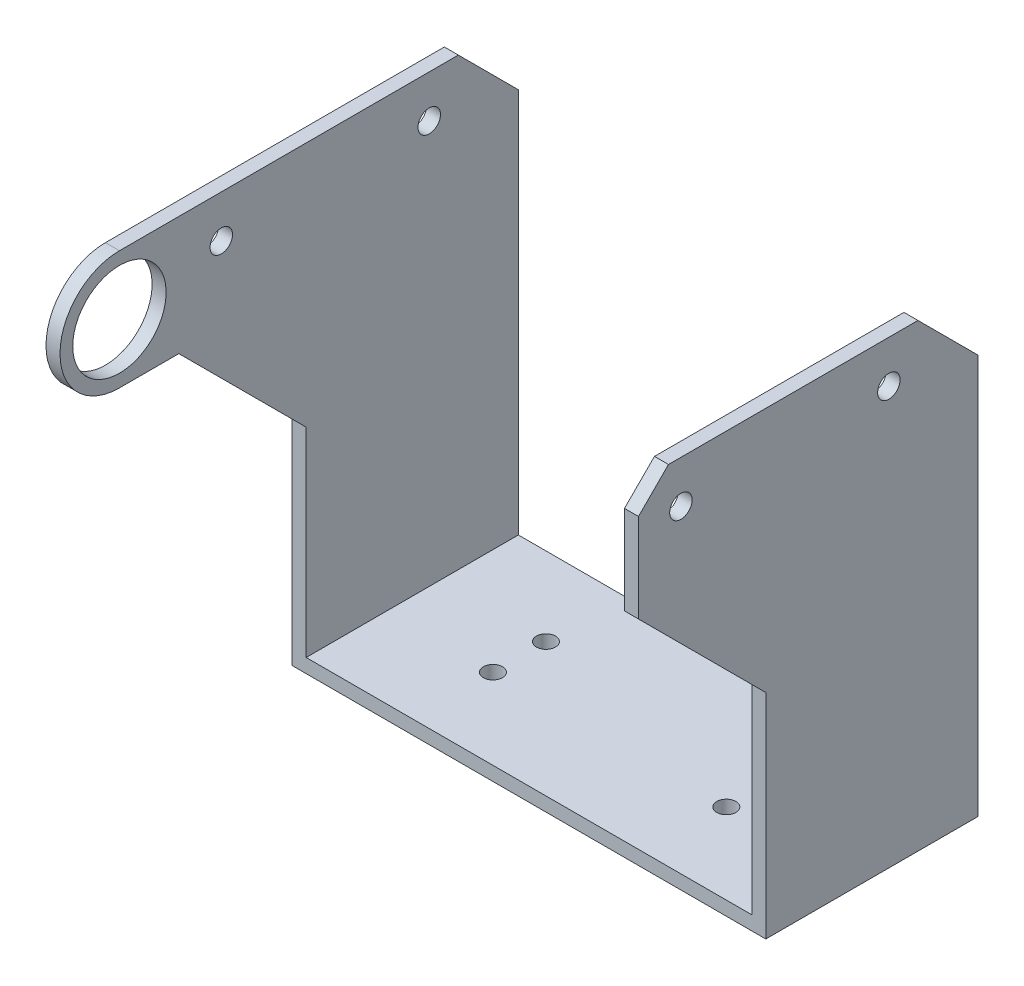
ISO-10303-21;
HEADER;
FILE_DESCRIPTION(('STEP AP214'),'2;1');
FILE_NAME('part.step','',(''),(''),'','','');
FILE_SCHEMA(('AUTOMOTIVE_DESIGN { 1 0 10303 214 1 1 1 1 }'));
ENDSEC;
DATA;
#1=APPLICATION_CONTEXT('core data for automotive mechanical design processes');
#2=APPLICATION_PROTOCOL_DEFINITION('international standard','automotive_design',2000,#1);
#3=PRODUCT_CONTEXT('',#1,'mechanical');
#4=PRODUCT('Part','Part','',(#3));
#5=PRODUCT_RELATED_PRODUCT_CATEGORY('part','',(#4));
#6=PRODUCT_DEFINITION_FORMATION('','',#4);
#7=PRODUCT_DEFINITION_CONTEXT('part definition',#1,'design');
#8=PRODUCT_DEFINITION('design','',#6,#7);
#9=PRODUCT_DEFINITION_SHAPE('','',#8);
#10=(LENGTH_UNIT() NAMED_UNIT(*) SI_UNIT(.MILLI.,.METRE.));
#11=(NAMED_UNIT(*) PLANE_ANGLE_UNIT() SI_UNIT($,.RADIAN.));
#12=(NAMED_UNIT(*) SI_UNIT($,.STERADIAN.) SOLID_ANGLE_UNIT());
#13=UNCERTAINTY_MEASURE_WITH_UNIT(LENGTH_MEASURE(1.E-05),#10,'distance_accuracy_value','');
#14=(GEOMETRIC_REPRESENTATION_CONTEXT(3) GLOBAL_UNCERTAINTY_ASSIGNED_CONTEXT((#13)) GLOBAL_UNIT_ASSIGNED_CONTEXT((#10,
#11,#12)) REPRESENTATION_CONTEXT('',''));
#15=CARTESIAN_POINT('',(0.,0.,0.));
#16=DIRECTION('',(0.,0.,1.));
#17=DIRECTION('',(1.,0.,0.));
#18=AXIS2_PLACEMENT_3D('',#15,#16,#17);
#19=CARTESIAN_POINT('',(0.,3.3,0.));
#20=DIRECTION('',(0.,-1.,0.));
#21=DIRECTION('',(0.,0.,-1.));
#22=AXIS2_PLACEMENT_3D('',#19,#20,#21);
#23=PLANE('',#22);
#24=DIRECTION('',(0.,0.,-1.));
#25=VECTOR('',#24,1.);
#26=CARTESIAN_POINT('',(52.5,3.3,25.));
#27=LINE('',#26,#25);
#28=CARTESIAN_POINT('',(52.5,3.3,25.));
#29=VERTEX_POINT('',#28);
#30=CARTESIAN_POINT('',(52.5,3.3,-25.));
#31=VERTEX_POINT('',#30);
#32=EDGE_CURVE('E266',#29,#31,#27,.T.);
#33=ORIENTED_EDGE('',*,*,#32,.T.);
#34=DIRECTION('',(-1.,0.,0.));
#35=VECTOR('',#34,1.);
#36=CARTESIAN_POINT('',(-52.5,3.3,-25.));
#37=LINE('',#36,#35);
#38=CARTESIAN_POINT('',(-52.5,3.3,-25.));
#39=VERTEX_POINT('',#38);
#40=EDGE_CURVE('E269',#31,#39,#37,.T.);
#41=ORIENTED_EDGE('',*,*,#40,.T.);
#42=DIRECTION('',(0.,0.,1.));
#43=VECTOR('',#42,1.);
#44=CARTESIAN_POINT('',(-52.5,3.3,25.));
#45=LINE('',#44,#43);
#46=CARTESIAN_POINT('',(-52.5,3.3,25.));
#47=VERTEX_POINT('',#46);
#48=EDGE_CURVE('E44',#39,#47,#45,.T.);
#49=ORIENTED_EDGE('',*,*,#48,.T.);
#50=DIRECTION('',(1.,0.,0.));
#51=VECTOR('',#50,1.);
#52=CARTESIAN_POINT('',(-52.5,3.3,25.));
#53=LINE('',#52,#51);
#54=EDGE_CURVE('E11',#47,#29,#53,.T.);
#55=ORIENTED_EDGE('',*,*,#54,.T.);
#56=EDGE_LOOP('',(#33,#41,#49,#55));
#57=FACE_BOUND('',#56,.T.);
#58=CARTESIAN_POINT('',(-27.5,3.3,-6.49999999999999));
#59=DIRECTION('',(0.,1.,0.));
#60=DIRECTION('',(0.,0.,1.));
#61=AXIS2_PLACEMENT_3D('',#58,#59,#60);
#62=CIRCLE('',#61,2.25);
#63=CARTESIAN_POINT('',(-27.5,3.3,-4.24999999999999));
#64=VERTEX_POINT('',#63);
#65=EDGE_CURVE('E260',#64,#64,#62,.T.);
#66=ORIENTED_EDGE('',*,*,#65,.F.);
#67=EDGE_LOOP('',(#66));
#68=FACE_BOUND('',#67,.T.);
#69=CARTESIAN_POINT('',(-27.5,3.3,6.00000000000001));
#70=DIRECTION('',(0.,1.,0.));
#71=DIRECTION('',(0.,0.,1.));
#72=AXIS2_PLACEMENT_3D('',#69,#70,#71);
#73=CIRCLE('',#72,2.25);
#74=CARTESIAN_POINT('',(-27.5,3.3,8.25000000000001));
#75=VERTEX_POINT('',#74);
#76=EDGE_CURVE('E254',#75,#75,#73,.T.);
#77=ORIENTED_EDGE('',*,*,#76,.F.);
#78=EDGE_LOOP('',(#77));
#79=FACE_BOUND('',#78,.T.);
#80=CARTESIAN_POINT('',(27.5,3.3,6.00000000000001));
#81=DIRECTION('',(0.,1.,0.));
#82=DIRECTION('',(0.,0.,-1.));
#83=AXIS2_PLACEMENT_3D('',#80,#81,#82);
#84=CIRCLE('',#83,2.25);
#85=CARTESIAN_POINT('',(27.5,3.3,3.75000000000001));
#86=VERTEX_POINT('',#85);
#87=EDGE_CURVE('E248',#86,#86,#84,.T.);
#88=ORIENTED_EDGE('',*,*,#87,.F.);
#89=EDGE_LOOP('',(#88));
#90=FACE_BOUND('',#89,.T.);
#91=CARTESIAN_POINT('',(27.5,3.3,-6.49999999999999));
#92=DIRECTION('',(0.,1.,0.));
#93=DIRECTION('',(0.,0.,-1.));
#94=AXIS2_PLACEMENT_3D('',#91,#92,#93);
#95=CIRCLE('',#94,2.25);
#96=CARTESIAN_POINT('',(27.5,3.3,-8.74999999999999));
#97=VERTEX_POINT('',#96);
#98=EDGE_CURVE('E242',#97,#97,#95,.T.);
#99=ORIENTED_EDGE('',*,*,#98,.F.);
#100=EDGE_LOOP('',(#99));
#101=FACE_BOUND('',#100,.T.);
#102=ADVANCED_FACE('F35',(#57,#68,#79,#90,#101),#23,.F.);
#103=CARTESIAN_POINT('',(0.,0.,0.));
#104=DIRECTION('',(0.,-1.,0.));
#105=DIRECTION('',(0.,0.,-1.));
#106=AXIS2_PLACEMENT_3D('',#103,#104,#105);
#107=PLANE('',#106);
#108=CARTESIAN_POINT('',(27.5,0.,6.00000000000001));
#109=DIRECTION('',(0.,1.,0.));
#110=DIRECTION('',(0.,0.,-1.));
#111=AXIS2_PLACEMENT_3D('',#108,#109,#110);
#112=CIRCLE('',#111,2.25);
#113=CARTESIAN_POINT('',(27.5,0.,3.75000000000001));
#114=VERTEX_POINT('',#113);
#115=EDGE_CURVE('E245',#114,#114,#112,.T.);
#116=ORIENTED_EDGE('',*,*,#115,.T.);
#117=EDGE_LOOP('',(#116));
#118=FACE_BOUND('',#117,.T.);
#119=CARTESIAN_POINT('',(-27.5,0.,-6.49999999999999));
#120=DIRECTION('',(0.,1.,0.));
#121=DIRECTION('',(0.,0.,1.));
#122=AXIS2_PLACEMENT_3D('',#119,#120,#121);
#123=CIRCLE('',#122,2.25);
#124=CARTESIAN_POINT('',(-27.5,0.,-4.24999999999999));
#125=VERTEX_POINT('',#124);
#126=EDGE_CURVE('E257',#125,#125,#123,.T.);
#127=ORIENTED_EDGE('',*,*,#126,.T.);
#128=EDGE_LOOP('',(#127));
#129=FACE_BOUND('',#128,.T.);
#130=DIRECTION('',(-1.,0.,0.));
#131=VECTOR('',#130,1.);
#132=CARTESIAN_POINT('',(-52.5,0.,-25.));
#133=LINE('',#132,#131);
#134=CARTESIAN_POINT('',(55.8,0.,-25.));
#135=VERTEX_POINT('',#134);
#136=CARTESIAN_POINT('',(-55.8,0.,-25.));
#137=VERTEX_POINT('',#136);
#138=EDGE_CURVE('E263',#135,#137,#133,.T.);
#139=ORIENTED_EDGE('',*,*,#138,.F.);
#140=DIRECTION('',(0.,0.,-1.));
#141=VECTOR('',#140,1.);
#142=CARTESIAN_POINT('',(55.8,0.,25.));
#143=LINE('',#142,#141);
#144=CARTESIAN_POINT('',(55.8,0.,25.));
#145=VERTEX_POINT('',#144);
#146=EDGE_CURVE('E191',#145,#135,#143,.T.);
#147=ORIENTED_EDGE('',*,*,#146,.F.);
#148=DIRECTION('',(1.,0.,0.));
#149=VECTOR('',#148,1.);
#150=CARTESIAN_POINT('',(-52.5,0.,25.));
#151=LINE('',#150,#149);
#152=CARTESIAN_POINT('',(-55.8,0.,25.));
#153=VERTEX_POINT('',#152);
#154=EDGE_CURVE('E39',#153,#145,#151,.T.);
#155=ORIENTED_EDGE('',*,*,#154,.F.);
#156=DIRECTION('',(0.,0.,1.));
#157=VECTOR('',#156,1.);
#158=CARTESIAN_POINT('',(-55.8,0.,-25.));
#159=LINE('',#158,#157);
#160=EDGE_CURVE('E168',#137,#153,#159,.T.);
#161=ORIENTED_EDGE('',*,*,#160,.F.);
#162=EDGE_LOOP('',(#139,#147,#155,#161));
#163=FACE_BOUND('',#162,.T.);
#164=CARTESIAN_POINT('',(-27.5,0.,6.00000000000001));
#165=DIRECTION('',(0.,1.,0.));
#166=DIRECTION('',(0.,0.,1.));
#167=AXIS2_PLACEMENT_3D('',#164,#165,#166);
#168=CIRCLE('',#167,2.25);
#169=CARTESIAN_POINT('',(-27.5,0.,8.25000000000001));
#170=VERTEX_POINT('',#169);
#171=EDGE_CURVE('E251',#170,#170,#168,.T.);
#172=ORIENTED_EDGE('',*,*,#171,.T.);
#173=EDGE_LOOP('',(#172));
#174=FACE_BOUND('',#173,.T.);
#175=CARTESIAN_POINT('',(27.5,0.,-6.49999999999999));
#176=DIRECTION('',(0.,1.,0.));
#177=DIRECTION('',(0.,0.,-1.));
#178=AXIS2_PLACEMENT_3D('',#175,#176,#177);
#179=CIRCLE('',#178,2.25);
#180=CARTESIAN_POINT('',(27.5,0.,-8.74999999999999));
#181=VERTEX_POINT('',#180);
#182=EDGE_CURVE('E241',#181,#181,#179,.T.);
#183=ORIENTED_EDGE('',*,*,#182,.T.);
#184=EDGE_LOOP('',(#183));
#185=FACE_BOUND('',#184,.T.);
#186=ADVANCED_FACE('F283',(#118,#129,#163,#174,#185),#107,.T.);
#187=CARTESIAN_POINT('',(-52.5,3.3,-25.));
#188=DIRECTION('',(0.,0.,1.));
#189=DIRECTION('',(1.,0.,0.));
#190=AXIS2_PLACEMENT_3D('',#187,#188,#189);
#191=PLANE('',#190);
#192=ORIENTED_EDGE('',*,*,#138,.T.);
#193=DIRECTION('',(0.,-1.,0.));
#194=VECTOR('',#193,1.);
#195=CARTESIAN_POINT('',(-55.8,94.1578643762691,-25.0000000000001));
#196=LINE('',#195,#194);
#197=CARTESIAN_POINT('',(-55.8,94.1578643762691,-25.0000000000001));
#198=VERTEX_POINT('',#197);
#199=EDGE_CURVE('E354',#198,#137,#196,.T.);
#200=ORIENTED_EDGE('',*,*,#199,.F.);
#201=DIRECTION('',(1.,0.,0.));
#202=VECTOR('',#201,1.);
#203=CARTESIAN_POINT('',(-55.8,94.1578643762691,-25.0000000000001));
#204=LINE('',#203,#202);
#205=CARTESIAN_POINT('',(-52.5,94.1578643762691,-25.0000000000001));
#206=VERTEX_POINT('',#205);
#207=EDGE_CURVE('E320',#198,#206,#204,.T.);
#208=ORIENTED_EDGE('',*,*,#207,.T.);
#209=DIRECTION('',(0.,-1.,0.));
#210=VECTOR('',#209,1.);
#211=CARTESIAN_POINT('',(-52.5,94.1578643762691,-25.0000000000001));
#212=LINE('',#211,#210);
#213=EDGE_CURVE('E170',#206,#39,#212,.T.);
#214=ORIENTED_EDGE('',*,*,#213,.T.);
#215=ORIENTED_EDGE('',*,*,#40,.F.);
#216=DIRECTION('',(0.,1.,0.));
#217=VECTOR('',#216,1.);
#218=CARTESIAN_POINT('',(52.5,0.,-25.));
#219=LINE('',#218,#217);
#220=CARTESIAN_POINT('',(52.5,94.1578643762691,-25.0000000000001));
#221=VERTEX_POINT('',#220);
#222=EDGE_CURVE('E60',#31,#221,#219,.T.);
#223=ORIENTED_EDGE('',*,*,#222,.T.);
#224=DIRECTION('',(-1.,0.,0.));
#225=VECTOR('',#224,1.);
#226=CARTESIAN_POINT('',(55.8,94.1578643762691,-25.0000000000001));
#227=LINE('',#226,#225);
#228=CARTESIAN_POINT('',(55.8,94.1578643762691,-25.0000000000001));
#229=VERTEX_POINT('',#228);
#230=EDGE_CURVE('E238',#229,#221,#227,.T.);
#231=ORIENTED_EDGE('',*,*,#230,.F.);
#232=DIRECTION('',(0.,1.,0.));
#233=VECTOR('',#232,1.);
#234=CARTESIAN_POINT('',(55.8,0.,-25.));
#235=LINE('',#234,#233);
#236=EDGE_CURVE('E194',#135,#229,#235,.T.);
#237=ORIENTED_EDGE('',*,*,#236,.F.);
#238=EDGE_LOOP('',(#192,#200,#208,#214,#215,#223,#231,#237));
#239=FACE_BOUND('',#238,.T.);
#240=ADVANCED_FACE('F37',(#239),#191,.F.);
#241=CARTESIAN_POINT('',(-52.5,3.3,25.));
#242=DIRECTION('',(0.,0.,-1.));
#243=DIRECTION('',(-1.,0.,0.));
#244=AXIS2_PLACEMENT_3D('',#241,#242,#243);
#245=PLANE('',#244);
#246=ORIENTED_EDGE('',*,*,#154,.T.);
#247=DIRECTION('',(0.,-1.,0.));
#248=VECTOR('',#247,1.);
#249=CARTESIAN_POINT('',(55.8,50.3,25.));
#250=LINE('',#249,#248);
#251=CARTESIAN_POINT('',(55.8,50.3,25.));
#252=VERTEX_POINT('',#251);
#253=EDGE_CURVE('E207',#252,#145,#250,.T.);
#254=ORIENTED_EDGE('',*,*,#253,.F.);
#255=DIRECTION('',(-1.,0.,0.));
#256=VECTOR('',#255,1.);
#257=CARTESIAN_POINT('',(55.8,50.3,25.));
#258=LINE('',#257,#256);
#259=CARTESIAN_POINT('',(52.5,50.3,25.));
#260=VERTEX_POINT('',#259);
#261=EDGE_CURVE('E210',#252,#260,#258,.T.);
#262=ORIENTED_EDGE('',*,*,#261,.T.);
#263=DIRECTION('',(0.,-1.,0.));
#264=VECTOR('',#263,1.);
#265=CARTESIAN_POINT('',(52.5,50.3,25.));
#266=LINE('',#265,#264);
#267=EDGE_CURVE('E195',#260,#29,#266,.T.);
#268=ORIENTED_EDGE('',*,*,#267,.T.);
#269=ORIENTED_EDGE('',*,*,#54,.F.);
#270=DIRECTION('',(0.,1.,0.));
#271=VECTOR('',#270,1.);
#272=CARTESIAN_POINT('',(-52.5,0.,25.));
#273=LINE('',#272,#271);
#274=CARTESIAN_POINT('',(-52.5,50.3,25.));
#275=VERTEX_POINT('',#274);
#276=EDGE_CURVE('E52',#47,#275,#273,.T.);
#277=ORIENTED_EDGE('',*,*,#276,.T.);
#278=DIRECTION('',(1.,0.,0.));
#279=VECTOR('',#278,1.);
#280=CARTESIAN_POINT('',(-55.8,50.3,25.));
#281=LINE('',#280,#279);
#282=CARTESIAN_POINT('',(-55.8,50.3,25.));
#283=VERTEX_POINT('',#282);
#284=EDGE_CURVE('E154',#283,#275,#281,.T.);
#285=ORIENTED_EDGE('',*,*,#284,.F.);
#286=DIRECTION('',(0.,1.,0.));
#287=VECTOR('',#286,1.);
#288=CARTESIAN_POINT('',(-55.8,0.,25.));
#289=LINE('',#288,#287);
#290=EDGE_CURVE('E160',#153,#283,#289,.T.);
#291=ORIENTED_EDGE('',*,*,#290,.F.);
#292=EDGE_LOOP('',(#246,#254,#262,#268,#269,#277,#285,#291));
#293=FACE_BOUND('',#292,.T.);
#294=ADVANCED_FACE('F172',(#293),#245,.F.);
#295=CARTESIAN_POINT('',(-27.5,3.3,-6.49999999999999));
#296=DIRECTION('',(0.,-1.,0.));
#297=DIRECTION('',(0.,0.,-1.));
#298=AXIS2_PLACEMENT_3D('',#295,#296,#297);
#299=CYLINDRICAL_SURFACE('',#298,2.25);
#300=ORIENTED_EDGE('',*,*,#65,.T.);
#301=EDGE_LOOP('',(#300));
#302=FACE_BOUND('',#301,.T.);
#303=ORIENTED_EDGE('',*,*,#126,.F.);
#304=EDGE_LOOP('',(#303));
#305=FACE_BOUND('',#304,.T.);
#306=ADVANCED_FACE('F405',(#302,#305),#299,.F.);
#307=CARTESIAN_POINT('',(-27.5,3.3,6.00000000000001));
#308=DIRECTION('',(0.,-1.,0.));
#309=DIRECTION('',(0.,0.,-1.));
#310=AXIS2_PLACEMENT_3D('',#307,#308,#309);
#311=CYLINDRICAL_SURFACE('',#310,2.25);
#312=ORIENTED_EDGE('',*,*,#76,.T.);
#313=EDGE_LOOP('',(#312));
#314=FACE_BOUND('',#313,.T.);
#315=ORIENTED_EDGE('',*,*,#171,.F.);
#316=EDGE_LOOP('',(#315));
#317=FACE_BOUND('',#316,.T.);
#318=ADVANCED_FACE('F412',(#314,#317),#311,.F.);
#319=CARTESIAN_POINT('',(27.5,3.3,6.00000000000001));
#320=DIRECTION('',(0.,-1.,0.));
#321=DIRECTION('',(0.,0.,-1.));
#322=AXIS2_PLACEMENT_3D('',#319,#320,#321);
#323=CYLINDRICAL_SURFACE('',#322,2.25);
#324=ORIENTED_EDGE('',*,*,#87,.T.);
#325=EDGE_LOOP('',(#324));
#326=FACE_BOUND('',#325,.T.);
#327=ORIENTED_EDGE('',*,*,#115,.F.);
#328=EDGE_LOOP('',(#327));
#329=FACE_BOUND('',#328,.T.);
#330=ADVANCED_FACE('F509',(#326,#329),#323,.F.);
#331=CARTESIAN_POINT('',(27.5,3.3,-6.49999999999999));
#332=DIRECTION('',(0.,-1.,0.));
#333=DIRECTION('',(0.,0.,-1.));
#334=AXIS2_PLACEMENT_3D('',#331,#332,#333);
#335=CYLINDRICAL_SURFACE('',#334,2.25);
#336=ORIENTED_EDGE('',*,*,#98,.T.);
#337=EDGE_LOOP('',(#336));
#338=FACE_BOUND('',#337,.T.);
#339=ORIENTED_EDGE('',*,*,#182,.F.);
#340=EDGE_LOOP('',(#339));
#341=FACE_BOUND('',#340,.T.);
#342=ADVANCED_FACE('F498',(#338,#341),#335,.F.);
#343=CARTESIAN_POINT('',(55.8,0.,0.));
#344=DIRECTION('',(1.,0.,0.));
#345=DIRECTION('',(0.,0.,-1.));
#346=AXIS2_PLACEMENT_3D('',#343,#344,#345);
#347=PLANE('',#346);
#348=CARTESIAN_POINT('',(55.8,98.3,44.9999999999999));
#349=DIRECTION('',(1.,0.,0.));
#350=DIRECTION('',(0.,0.,-1.));
#351=AXIS2_PLACEMENT_3D('',#348,#349,#350);
#352=CIRCLE('',#351,2.65);
#353=CARTESIAN_POINT('',(55.8,98.3,42.3499999999999));
#354=VERTEX_POINT('',#353);
#355=EDGE_CURVE('E186',#354,#354,#352,.T.);
#356=ORIENTED_EDGE('',*,*,#355,.F.);
#357=EDGE_LOOP('',(#356));
#358=FACE_BOUND('',#357,.T.);
#359=ORIENTED_EDGE('',*,*,#146,.T.);
#360=ORIENTED_EDGE('',*,*,#236,.T.);
#361=DIRECTION('',(0.,0.707106781186546,0.707106781186549));
#362=VECTOR('',#361,1.);
#363=CARTESIAN_POINT('',(55.8,94.1578643762691,-25.0000000000001));
#364=LINE('',#363,#362);
#365=CARTESIAN_POINT('',(55.8,108.3,-10.8578643762691));
#366=VERTEX_POINT('',#365);
#367=EDGE_CURVE('E197',#229,#366,#364,.T.);
#368=ORIENTED_EDGE('',*,*,#367,.T.);
#369=DIRECTION('',(0.,0.,1.));
#370=VECTOR('',#369,1.);
#371=CARTESIAN_POINT('',(55.8,108.3,-10.8578643762691));
#372=LINE('',#371,#370);
#373=CARTESIAN_POINT('',(55.8,108.3,47.9289321881345));
#374=VERTEX_POINT('',#373);
#375=EDGE_CURVE('E199',#366,#374,#372,.T.);
#376=ORIENTED_EDGE('',*,*,#375,.T.);
#377=DIRECTION('',(0.,-0.707106781186555,0.70710678118654));
#378=VECTOR('',#377,1.);
#379=CARTESIAN_POINT('',(55.8,108.3,47.9289321881345));
#380=LINE('',#379,#378);
#381=CARTESIAN_POINT('',(55.8,101.228932188134,54.9999999999999));
#382=VERTEX_POINT('',#381);
#383=EDGE_CURVE('E201',#374,#382,#380,.T.);
#384=ORIENTED_EDGE('',*,*,#383,.T.);
#385=DIRECTION('',(0.,-1.,0.));
#386=VECTOR('',#385,1.);
#387=CARTESIAN_POINT('',(55.8,101.228932188134,54.9999999999999));
#388=LINE('',#387,#386);
#389=CARTESIAN_POINT('',(55.8,80.2999999999998,54.9999999999999));
#390=VERTEX_POINT('',#389);
#391=EDGE_CURVE('E203',#382,#390,#388,.T.);
#392=ORIENTED_EDGE('',*,*,#391,.T.);
#393=DIRECTION('',(0.,-0.707106781186546,-0.707106781186549));
#394=VECTOR('',#393,1.);
#395=CARTESIAN_POINT('',(55.8,80.2999999999998,54.9999999999999));
#396=LINE('',#395,#394);
#397=EDGE_CURVE('E205',#390,#252,#396,.T.);
#398=ORIENTED_EDGE('',*,*,#397,.T.);
#399=ORIENTED_EDGE('',*,*,#253,.T.);
#400=EDGE_LOOP('',(#359,#360,#368,#376,#384,#392,#398,#399));
#401=FACE_BOUND('',#400,.T.);
#402=CARTESIAN_POINT('',(55.8,98.3,-4.0000000000001));
#403=DIRECTION('',(1.,0.,0.));
#404=DIRECTION('',(0.,0.,-1.));
#405=AXIS2_PLACEMENT_3D('',#402,#403,#404);
#406=CIRCLE('',#405,2.65);
#407=CARTESIAN_POINT('',(55.8,98.3,-6.6500000000001));
#408=VERTEX_POINT('',#407);
#409=EDGE_CURVE('E177',#408,#408,#406,.T.);
#410=ORIENTED_EDGE('',*,*,#409,.F.);
#411=EDGE_LOOP('',(#410));
#412=FACE_BOUND('',#411,.T.);
#413=ADVANCED_FACE('F279',(#358,#401,#412),#347,.T.);
#414=CARTESIAN_POINT('',(52.5,0.,0.));
#415=DIRECTION('',(1.,0.,0.));
#416=DIRECTION('',(0.,0.,-1.));
#417=AXIS2_PLACEMENT_3D('',#414,#415,#416);
#418=PLANE('',#417);
#419=ORIENTED_EDGE('',*,*,#32,.F.);
#420=ORIENTED_EDGE('',*,*,#267,.F.);
#421=DIRECTION('',(0.,-0.707106781186546,-0.707106781186549));
#422=VECTOR('',#421,1.);
#423=CARTESIAN_POINT('',(52.5,80.2999999999998,54.9999999999999));
#424=LINE('',#423,#422);
#425=CARTESIAN_POINT('',(52.5,80.2999999999998,54.9999999999999));
#426=VERTEX_POINT('',#425);
#427=EDGE_CURVE('E220',#426,#260,#424,.T.);
#428=ORIENTED_EDGE('',*,*,#427,.F.);
#429=DIRECTION('',(0.,-1.,0.));
#430=VECTOR('',#429,1.);
#431=CARTESIAN_POINT('',(52.5,101.228932188134,54.9999999999999));
#432=LINE('',#431,#430);
#433=CARTESIAN_POINT('',(52.5,101.228932188134,54.9999999999999));
#434=VERTEX_POINT('',#433);
#435=EDGE_CURVE('E218',#434,#426,#432,.T.);
#436=ORIENTED_EDGE('',*,*,#435,.F.);
#437=DIRECTION('',(0.,-0.707106781186555,0.70710678118654));
#438=VECTOR('',#437,1.);
#439=CARTESIAN_POINT('',(52.5,108.3,47.9289321881345));
#440=LINE('',#439,#438);
#441=CARTESIAN_POINT('',(52.5,108.3,47.9289321881345));
#442=VERTEX_POINT('',#441);
#443=EDGE_CURVE('E216',#442,#434,#440,.T.);
#444=ORIENTED_EDGE('',*,*,#443,.F.);
#445=DIRECTION('',(0.,0.,1.));
#446=VECTOR('',#445,1.);
#447=CARTESIAN_POINT('',(52.5,108.3,-10.8578643762691));
#448=LINE('',#447,#446);
#449=CARTESIAN_POINT('',(52.5,108.3,-10.8578643762691));
#450=VERTEX_POINT('',#449);
#451=EDGE_CURVE('E214',#450,#442,#448,.T.);
#452=ORIENTED_EDGE('',*,*,#451,.F.);
#453=DIRECTION('',(0.,0.707106781186546,0.707106781186549));
#454=VECTOR('',#453,1.);
#455=CARTESIAN_POINT('',(52.5,94.1578643762691,-25.0000000000001));
#456=LINE('',#455,#454);
#457=EDGE_CURVE('E212',#221,#450,#456,.T.);
#458=ORIENTED_EDGE('',*,*,#457,.F.);
#459=ORIENTED_EDGE('',*,*,#222,.F.);
#460=EDGE_LOOP('',(#419,#420,#428,#436,#444,#452,#458,#459));
#461=FACE_BOUND('',#460,.T.);
#462=CARTESIAN_POINT('',(52.5,98.3,44.9999999999999));
#463=DIRECTION('',(1.,0.,0.));
#464=DIRECTION('',(0.,0.,-1.));
#465=AXIS2_PLACEMENT_3D('',#462,#463,#464);
#466=CIRCLE('',#465,2.65);
#467=CARTESIAN_POINT('',(52.5,98.3,42.3499999999999));
#468=VERTEX_POINT('',#467);
#469=EDGE_CURVE('E184',#468,#468,#466,.T.);
#470=ORIENTED_EDGE('',*,*,#469,.T.);
#471=EDGE_LOOP('',(#470));
#472=FACE_BOUND('',#471,.T.);
#473=CARTESIAN_POINT('',(52.5,98.3,-4.0000000000001));
#474=DIRECTION('',(1.,0.,0.));
#475=DIRECTION('',(0.,0.,-1.));
#476=AXIS2_PLACEMENT_3D('',#473,#474,#475);
#477=CIRCLE('',#476,2.65);
#478=CARTESIAN_POINT('',(52.5,98.3,-6.6500000000001));
#479=VERTEX_POINT('',#478);
#480=EDGE_CURVE('E174',#479,#479,#477,.T.);
#481=ORIENTED_EDGE('',*,*,#480,.T.);
#482=EDGE_LOOP('',(#481));
#483=FACE_BOUND('',#482,.T.);
#484=ADVANCED_FACE('F309',(#461,#472,#483),#418,.F.);
#485=CARTESIAN_POINT('',(55.8,94.1578643762691,-25.0000000000001));
#486=DIRECTION('',(0.,-0.707106781186549,0.707106781186546));
#487=DIRECTION('',(0.,-0.707106781186546,-0.707106781186549));
#488=AXIS2_PLACEMENT_3D('',#485,#486,#487);
#489=PLANE('',#488);
#490=ORIENTED_EDGE('',*,*,#457,.T.);
#491=DIRECTION('',(-1.,0.,0.));
#492=VECTOR('',#491,1.);
#493=CARTESIAN_POINT('',(55.8,108.3,-10.8578643762691));
#494=LINE('',#493,#492);
#495=EDGE_CURVE('E235',#366,#450,#494,.T.);
#496=ORIENTED_EDGE('',*,*,#495,.F.);
#497=ORIENTED_EDGE('',*,*,#367,.F.);
#498=ORIENTED_EDGE('',*,*,#230,.T.);
#499=EDGE_LOOP('',(#490,#496,#497,#498));
#500=FACE_BOUND('',#499,.T.);
#501=ADVANCED_FACE('F291',(#500),#489,.F.);
#502=CARTESIAN_POINT('',(55.8,108.3,-10.8578643762691));
#503=DIRECTION('',(0.,-1.,0.));
#504=DIRECTION('',(0.,0.,-1.));
#505=AXIS2_PLACEMENT_3D('',#502,#503,#504);
#506=PLANE('',#505);
#507=ORIENTED_EDGE('',*,*,#451,.T.);
#508=DIRECTION('',(-1.,0.,0.));
#509=VECTOR('',#508,1.);
#510=CARTESIAN_POINT('',(55.8,108.3,47.9289321881345));
#511=LINE('',#510,#509);
#512=EDGE_CURVE('E232',#374,#442,#511,.T.);
#513=ORIENTED_EDGE('',*,*,#512,.F.);
#514=ORIENTED_EDGE('',*,*,#375,.F.);
#515=ORIENTED_EDGE('',*,*,#495,.T.);
#516=EDGE_LOOP('',(#507,#513,#514,#515));
#517=FACE_BOUND('',#516,.T.);
#518=ADVANCED_FACE('F294',(#517),#506,.F.);
#519=CARTESIAN_POINT('',(55.8,108.3,47.9289321881345));
#520=DIRECTION('',(0.,-0.70710678118654,-0.707106781186555));
#521=DIRECTION('',(0.,0.707106781186555,-0.70710678118654));
#522=AXIS2_PLACEMENT_3D('',#519,#520,#521);
#523=PLANE('',#522);
#524=ORIENTED_EDGE('',*,*,#443,.T.);
#525=DIRECTION('',(-1.,0.,0.));
#526=VECTOR('',#525,1.);
#527=CARTESIAN_POINT('',(55.8,101.228932188134,54.9999999999999));
#528=LINE('',#527,#526);
#529=EDGE_CURVE('E229',#382,#434,#528,.T.);
#530=ORIENTED_EDGE('',*,*,#529,.F.);
#531=ORIENTED_EDGE('',*,*,#383,.F.);
#532=ORIENTED_EDGE('',*,*,#512,.T.);
#533=EDGE_LOOP('',(#524,#530,#531,#532));
#534=FACE_BOUND('',#533,.T.);
#535=ADVANCED_FACE('F299',(#534),#523,.F.);
#536=CARTESIAN_POINT('',(55.8,101.228932188134,54.9999999999999));
#537=DIRECTION('',(0.,0.,-1.));
#538=DIRECTION('',(-1.,0.,0.));
#539=AXIS2_PLACEMENT_3D('',#536,#537,#538);
#540=PLANE('',#539);
#541=ORIENTED_EDGE('',*,*,#435,.T.);
#542=DIRECTION('',(-1.,0.,0.));
#543=VECTOR('',#542,1.);
#544=CARTESIAN_POINT('',(55.8,80.2999999999998,54.9999999999999));
#545=LINE('',#544,#543);
#546=EDGE_CURVE('E226',#390,#426,#545,.T.);
#547=ORIENTED_EDGE('',*,*,#546,.F.);
#548=ORIENTED_EDGE('',*,*,#391,.F.);
#549=ORIENTED_EDGE('',*,*,#529,.T.);
#550=EDGE_LOOP('',(#541,#547,#548,#549));
#551=FACE_BOUND('',#550,.T.);
#552=ADVANCED_FACE('F303',(#551),#540,.F.);
#553=CARTESIAN_POINT('',(55.8,80.2999999999998,54.9999999999999));
#554=DIRECTION('',(0.,0.707106781186549,-0.707106781186546));
#555=DIRECTION('',(0.,0.707106781186546,0.707106781186549));
#556=AXIS2_PLACEMENT_3D('',#553,#554,#555);
#557=PLANE('',#556);
#558=ORIENTED_EDGE('',*,*,#427,.T.);
#559=ORIENTED_EDGE('',*,*,#261,.F.);
#560=ORIENTED_EDGE('',*,*,#397,.F.);
#561=ORIENTED_EDGE('',*,*,#546,.T.);
#562=EDGE_LOOP('',(#558,#559,#560,#561));
#563=FACE_BOUND('',#562,.T.);
#564=ADVANCED_FACE('F307',(#563),#557,.F.);
#565=CARTESIAN_POINT('',(55.8,98.3,44.9999999999999));
#566=DIRECTION('',(-1.,0.,0.));
#567=DIRECTION('',(0.,0.,1.));
#568=AXIS2_PLACEMENT_3D('',#565,#566,#567);
#569=CYLINDRICAL_SURFACE('',#568,2.65);
#570=ORIENTED_EDGE('',*,*,#355,.T.);
#571=EDGE_LOOP('',(#570));
#572=FACE_BOUND('',#571,.T.);
#573=ORIENTED_EDGE('',*,*,#469,.F.);
#574=EDGE_LOOP('',(#573));
#575=FACE_BOUND('',#574,.T.);
#576=ADVANCED_FACE('F392',(#572,#575),#569,.F.);
#577=CARTESIAN_POINT('',(55.8,98.3,-4.0000000000001));
#578=DIRECTION('',(-1.,0.,0.));
#579=DIRECTION('',(0.,0.,1.));
#580=AXIS2_PLACEMENT_3D('',#577,#578,#579);
#581=CYLINDRICAL_SURFACE('',#580,2.65);
#582=ORIENTED_EDGE('',*,*,#409,.T.);
#583=EDGE_LOOP('',(#582));
#584=FACE_BOUND('',#583,.T.);
#585=ORIENTED_EDGE('',*,*,#480,.F.);
#586=EDGE_LOOP('',(#585));
#587=FACE_BOUND('',#586,.T.);
#588=ADVANCED_FACE('F384',(#584,#587),#581,.F.);
#589=CARTESIAN_POINT('',(-55.8,94.3,69.));
#590=DIRECTION('',(-1.,0.,0.));
#591=DIRECTION('',(0.,0.,1.));
#592=AXIS2_PLACEMENT_3D('',#589,#590,#591);
#593=PLANE('',#592);
#594=CARTESIAN_POINT('',(-55.8,98.3,-4.0000000000001));
#595=DIRECTION('',(-1.,0.,0.));
#596=DIRECTION('',(0.,0.,1.));
#597=AXIS2_PLACEMENT_3D('',#594,#595,#596);
#598=CIRCLE('',#597,2.65);
#599=CARTESIAN_POINT('',(-55.8,98.3,-1.3500000000001));
#600=VERTEX_POINT('',#599);
#601=EDGE_CURVE('E365',#600,#600,#598,.T.);
#602=ORIENTED_EDGE('',*,*,#601,.F.);
#603=EDGE_LOOP('',(#602));
#604=FACE_BOUND('',#603,.T.);
#605=ORIENTED_EDGE('',*,*,#290,.T.);
#606=DIRECTION('',(0.,0.707106781186546,0.707106781186549));
#607=VECTOR('',#606,1.);
#608=CARTESIAN_POINT('',(-55.8,50.3,25.));
#609=LINE('',#608,#607);
#610=CARTESIAN_POINT('',(-55.8,80.2999999999998,54.9999999999999));
#611=VERTEX_POINT('',#610);
#612=EDGE_CURVE('E150',#283,#611,#609,.T.);
#613=ORIENTED_EDGE('',*,*,#612,.T.);
#614=DIRECTION('',(0.,0.,1.));
#615=VECTOR('',#614,1.);
#616=CARTESIAN_POINT('',(-55.8,80.2999999999998,54.9999999999999));
#617=LINE('',#616,#615);
#618=CARTESIAN_POINT('',(-55.8,80.3,69.));
#619=VERTEX_POINT('',#618);
#620=EDGE_CURVE('E159',#611,#619,#617,.T.);
#621=ORIENTED_EDGE('',*,*,#620,.T.);
#622=CARTESIAN_POINT('',(-55.8,94.3,69.));
#623=DIRECTION('',(-1.,0.,0.));
#624=DIRECTION('',(0.,0.,1.));
#625=AXIS2_PLACEMENT_3D('',#622,#623,#624);
#626=CIRCLE('',#625,14.);
#627=CARTESIAN_POINT('',(-55.8,108.3,69.));
#628=VERTEX_POINT('',#627);
#629=EDGE_CURVE('E342',#619,#628,#626,.T.);
#630=ORIENTED_EDGE('',*,*,#629,.T.);
#631=DIRECTION('',(0.,0.,-1.));
#632=VECTOR('',#631,1.);
#633=CARTESIAN_POINT('',(-55.8,108.3,47.9289321881345));
#634=LINE('',#633,#632);
#635=CARTESIAN_POINT('',(-55.8,108.3,-10.8578643762691));
#636=VERTEX_POINT('',#635);
#637=EDGE_CURVE('E358',#628,#636,#634,.T.);
#638=ORIENTED_EDGE('',*,*,#637,.T.);
#639=DIRECTION('',(0.,-0.707106781186546,-0.707106781186549));
#640=VECTOR('',#639,1.);
#641=CARTESIAN_POINT('',(-55.8,108.3,-10.8578643762691));
#642=LINE('',#641,#640);
#643=EDGE_CURVE('E356',#636,#198,#642,.T.);
#644=ORIENTED_EDGE('',*,*,#643,.T.);
#645=ORIENTED_EDGE('',*,*,#199,.T.);
#646=ORIENTED_EDGE('',*,*,#160,.T.);
#647=EDGE_LOOP('',(#605,#613,#621,#630,#638,#644,#645,#646));
#648=FACE_BOUND('',#647,.T.);
#649=CARTESIAN_POINT('',(-55.8,94.3,69.));
#650=DIRECTION('',(-1.,0.,0.));
#651=DIRECTION('',(0.,0.,1.));
#652=AXIS2_PLACEMENT_3D('',#649,#650,#651);
#653=CIRCLE('',#652,11.);
#654=CARTESIAN_POINT('',(-55.8,94.3,80.));
#655=VERTEX_POINT('',#654);
#656=EDGE_CURVE('E352',#655,#655,#653,.T.);
#657=ORIENTED_EDGE('',*,*,#656,.F.);
#658=EDGE_LOOP('',(#657));
#659=FACE_BOUND('',#658,.T.);
#660=CARTESIAN_POINT('',(-55.8,98.3,44.9999999999999));
#661=DIRECTION('',(-1.,0.,0.));
#662=DIRECTION('',(0.,0.,1.));
#663=AXIS2_PLACEMENT_3D('',#660,#661,#662);
#664=CIRCLE('',#663,2.65);
#665=CARTESIAN_POINT('',(-55.8,98.3,47.6499999999999));
#666=VERTEX_POINT('',#665);
#667=EDGE_CURVE('E371',#666,#666,#664,.T.);
#668=ORIENTED_EDGE('',*,*,#667,.F.);
#669=EDGE_LOOP('',(#668));
#670=FACE_BOUND('',#669,.T.);
#671=ADVANCED_FACE('F164',(#604,#648,#659,#670),#593,.T.);
#672=CARTESIAN_POINT('',(-52.5,94.3,69.));
#673=DIRECTION('',(-1.,0.,0.));
#674=DIRECTION('',(0.,0.,1.));
#675=AXIS2_PLACEMENT_3D('',#672,#673,#674);
#676=PLANE('',#675);
#677=ORIENTED_EDGE('',*,*,#48,.F.);
#678=ORIENTED_EDGE('',*,*,#213,.F.);
#679=DIRECTION('',(0.,-0.707106781186546,-0.707106781186549));
#680=VECTOR('',#679,1.);
#681=CARTESIAN_POINT('',(-52.5,108.3,-10.8578643762691));
#682=LINE('',#681,#680);
#683=CARTESIAN_POINT('',(-52.5,108.3,-10.8578643762691));
#684=VERTEX_POINT('',#683);
#685=EDGE_CURVE('E321',#684,#206,#682,.T.);
#686=ORIENTED_EDGE('',*,*,#685,.F.);
#687=DIRECTION('',(0.,0.,-1.));
#688=VECTOR('',#687,1.);
#689=CARTESIAN_POINT('',(-52.5,108.3,47.9289321881345));
#690=LINE('',#689,#688);
#691=CARTESIAN_POINT('',(-52.5,108.3,69.));
#692=VERTEX_POINT('',#691);
#693=EDGE_CURVE('E323',#692,#684,#690,.T.);
#694=ORIENTED_EDGE('',*,*,#693,.F.);
#695=CARTESIAN_POINT('',(-52.5,94.3,69.));
#696=DIRECTION('',(-1.,0.,0.));
#697=DIRECTION('',(0.,0.,1.));
#698=AXIS2_PLACEMENT_3D('',#695,#696,#697);
#699=CIRCLE('',#698,14.);
#700=CARTESIAN_POINT('',(-52.5,80.3,69.));
#701=VERTEX_POINT('',#700);
#702=EDGE_CURVE('E341',#701,#692,#699,.T.);
#703=ORIENTED_EDGE('',*,*,#702,.F.);
#704=DIRECTION('',(0.,0.,1.));
#705=VECTOR('',#704,1.);
#706=CARTESIAN_POINT('',(-52.5,80.2999999999998,54.9999999999999));
#707=LINE('',#706,#705);
#708=CARTESIAN_POINT('',(-52.5,80.2999999999998,54.9999999999999));
#709=VERTEX_POINT('',#708);
#710=EDGE_CURVE('E345',#709,#701,#707,.T.);
#711=ORIENTED_EDGE('',*,*,#710,.F.);
#712=DIRECTION('',(0.,0.707106781186546,0.707106781186549));
#713=VECTOR('',#712,1.);
#714=CARTESIAN_POINT('',(-52.5,50.3,25.));
#715=LINE('',#714,#713);
#716=EDGE_CURVE('E347',#275,#709,#715,.T.);
#717=ORIENTED_EDGE('',*,*,#716,.F.);
#718=ORIENTED_EDGE('',*,*,#276,.F.);
#719=EDGE_LOOP('',(#677,#678,#686,#694,#703,#711,#717,#718));
#720=FACE_BOUND('',#719,.T.);
#721=CARTESIAN_POINT('',(-52.5,94.3,69.));
#722=DIRECTION('',(-1.,0.,0.));
#723=DIRECTION('',(0.,0.,1.));
#724=AXIS2_PLACEMENT_3D('',#721,#722,#723);
#725=CIRCLE('',#724,11.);
#726=CARTESIAN_POINT('',(-52.5,94.3,80.));
#727=VERTEX_POINT('',#726);
#728=EDGE_CURVE('E362',#727,#727,#725,.T.);
#729=ORIENTED_EDGE('',*,*,#728,.T.);
#730=EDGE_LOOP('',(#729));
#731=FACE_BOUND('',#730,.T.);
#732=CARTESIAN_POINT('',(-52.5,98.3,-4.0000000000001));
#733=DIRECTION('',(-1.,0.,0.));
#734=DIRECTION('',(0.,0.,1.));
#735=AXIS2_PLACEMENT_3D('',#732,#733,#734);
#736=CIRCLE('',#735,2.65);
#737=CARTESIAN_POINT('',(-52.5,98.3,-1.3500000000001));
#738=VERTEX_POINT('',#737);
#739=EDGE_CURVE('E368',#738,#738,#736,.T.);
#740=ORIENTED_EDGE('',*,*,#739,.T.);
#741=EDGE_LOOP('',(#740));
#742=FACE_BOUND('',#741,.T.);
#743=CARTESIAN_POINT('',(-52.5,98.3,44.9999999999999));
#744=DIRECTION('',(-1.,0.,0.));
#745=DIRECTION('',(0.,0.,1.));
#746=AXIS2_PLACEMENT_3D('',#743,#744,#745);
#747=CIRCLE('',#746,2.65);
#748=CARTESIAN_POINT('',(-52.5,98.3,47.6499999999999));
#749=VERTEX_POINT('',#748);
#750=EDGE_CURVE('E374',#749,#749,#747,.T.);
#751=ORIENTED_EDGE('',*,*,#750,.T.);
#752=EDGE_LOOP('',(#751));
#753=FACE_BOUND('',#752,.T.);
#754=ADVANCED_FACE('F315',(#720,#731,#742,#753),#676,.F.);
#755=CARTESIAN_POINT('',(-55.8,50.3,25.));
#756=DIRECTION('',(0.,0.707106781186549,-0.707106781186546));
#757=DIRECTION('',(0.,0.707106781186546,0.707106781186549));
#758=AXIS2_PLACEMENT_3D('',#755,#756,#757);
#759=PLANE('',#758);
#760=ORIENTED_EDGE('',*,*,#716,.T.);
#761=DIRECTION('',(1.,0.,0.));
#762=VECTOR('',#761,1.);
#763=CARTESIAN_POINT('',(-55.8,80.2999999999998,54.9999999999999));
#764=LINE('',#763,#762);
#765=EDGE_CURVE('E156',#611,#709,#764,.T.);
#766=ORIENTED_EDGE('',*,*,#765,.F.);
#767=ORIENTED_EDGE('',*,*,#612,.F.);
#768=ORIENTED_EDGE('',*,*,#284,.T.);
#769=EDGE_LOOP('',(#760,#766,#767,#768));
#770=FACE_BOUND('',#769,.T.);
#771=ADVANCED_FACE('F152',(#770),#759,.F.);
#772=CARTESIAN_POINT('',(-55.8,80.2999999999998,54.9999999999999));
#773=DIRECTION('',(0.,1.,0.));
#774=DIRECTION('',(0.,0.,1.));
#775=AXIS2_PLACEMENT_3D('',#772,#773,#774);
#776=PLANE('',#775);
#777=ORIENTED_EDGE('',*,*,#710,.T.);
#778=DIRECTION('',(1.,0.,0.));
#779=VECTOR('',#778,1.);
#780=CARTESIAN_POINT('',(-55.8,80.3,69.));
#781=LINE('',#780,#779);
#782=EDGE_CURVE('E179',#619,#701,#781,.T.);
#783=ORIENTED_EDGE('',*,*,#782,.F.);
#784=ORIENTED_EDGE('',*,*,#620,.F.);
#785=ORIENTED_EDGE('',*,*,#765,.T.);
#786=EDGE_LOOP('',(#777,#783,#784,#785));
#787=FACE_BOUND('',#786,.T.);
#788=ADVANCED_FACE('F573',(#787),#776,.F.);
#789=CARTESIAN_POINT('',(-55.8,94.3,69.));
#790=DIRECTION('',(1.,0.,0.));
#791=DIRECTION('',(0.,0.,-1.));
#792=AXIS2_PLACEMENT_3D('',#789,#790,#791);
#793=CYLINDRICAL_SURFACE('',#792,14.);
#794=ORIENTED_EDGE('',*,*,#702,.T.);
#795=DIRECTION('',(1.,0.,0.));
#796=VECTOR('',#795,1.);
#797=CARTESIAN_POINT('',(-55.8,108.3,69.));
#798=LINE('',#797,#796);
#799=EDGE_CURVE('E331',#628,#692,#798,.T.);
#800=ORIENTED_EDGE('',*,*,#799,.F.);
#801=ORIENTED_EDGE('',*,*,#629,.F.);
#802=ORIENTED_EDGE('',*,*,#782,.T.);
#803=EDGE_LOOP('',(#794,#800,#801,#802));
#804=FACE_BOUND('',#803,.T.);
#805=ADVANCED_FACE('F339',(#804),#793,.T.);
#806=CARTESIAN_POINT('',(-55.8,108.3,47.9289321881345));
#807=DIRECTION('',(0.,-1.,0.));
#808=DIRECTION('',(0.,0.,-1.));
#809=AXIS2_PLACEMENT_3D('',#806,#807,#808);
#810=PLANE('',#809);
#811=ORIENTED_EDGE('',*,*,#693,.T.);
#812=DIRECTION('',(1.,0.,0.));
#813=VECTOR('',#812,1.);
#814=CARTESIAN_POINT('',(-55.8,108.3,-10.8578643762691));
#815=LINE('',#814,#813);
#816=EDGE_CURVE('E328',#636,#684,#815,.T.);
#817=ORIENTED_EDGE('',*,*,#816,.F.);
#818=ORIENTED_EDGE('',*,*,#637,.F.);
#819=ORIENTED_EDGE('',*,*,#799,.T.);
#820=EDGE_LOOP('',(#811,#817,#818,#819));
#821=FACE_BOUND('',#820,.T.);
#822=ADVANCED_FACE('F588',(#821),#810,.F.);
#823=CARTESIAN_POINT('',(-55.8,108.3,-10.8578643762691));
#824=DIRECTION('',(0.,-0.707106781186549,0.707106781186546));
#825=DIRECTION('',(0.,-0.707106781186546,-0.707106781186549));
#826=AXIS2_PLACEMENT_3D('',#823,#824,#825);
#827=PLANE('',#826);
#828=ORIENTED_EDGE('',*,*,#685,.T.);
#829=ORIENTED_EDGE('',*,*,#207,.F.);
#830=ORIENTED_EDGE('',*,*,#643,.F.);
#831=ORIENTED_EDGE('',*,*,#816,.T.);
#832=EDGE_LOOP('',(#828,#829,#830,#831));
#833=FACE_BOUND('',#832,.T.);
#834=ADVANCED_FACE('F596',(#833),#827,.F.);
#835=CARTESIAN_POINT('',(-55.8,94.3,69.));
#836=DIRECTION('',(1.,0.,0.));
#837=DIRECTION('',(0.,0.,-1.));
#838=AXIS2_PLACEMENT_3D('',#835,#836,#837);
#839=CYLINDRICAL_SURFACE('',#838,11.);
#840=ORIENTED_EDGE('',*,*,#656,.T.);
#841=EDGE_LOOP('',(#840));
#842=FACE_BOUND('',#841,.T.);
#843=ORIENTED_EDGE('',*,*,#728,.F.);
#844=EDGE_LOOP('',(#843));
#845=FACE_BOUND('',#844,.T.);
#846=ADVANCED_FACE('F608',(#842,#845),#839,.F.);
#847=CARTESIAN_POINT('',(-55.8,98.3,-4.0000000000001));
#848=DIRECTION('',(1.,0.,0.));
#849=DIRECTION('',(0.,0.,-1.));
#850=AXIS2_PLACEMENT_3D('',#847,#848,#849);
#851=CYLINDRICAL_SURFACE('',#850,2.65);
#852=ORIENTED_EDGE('',*,*,#601,.T.);
#853=EDGE_LOOP('',(#852));
#854=FACE_BOUND('',#853,.T.);
#855=ORIENTED_EDGE('',*,*,#739,.F.);
#856=EDGE_LOOP('',(#855));
#857=FACE_BOUND('',#856,.T.);
#858=ADVANCED_FACE('F617',(#854,#857),#851,.F.);
#859=CARTESIAN_POINT('',(-55.8,98.3,44.9999999999999));
#860=DIRECTION('',(1.,0.,0.));
#861=DIRECTION('',(0.,0.,-1.));
#862=AXIS2_PLACEMENT_3D('',#859,#860,#861);
#863=CYLINDRICAL_SURFACE('',#862,2.65);
#864=ORIENTED_EDGE('',*,*,#667,.T.);
#865=EDGE_LOOP('',(#864));
#866=FACE_BOUND('',#865,.T.);
#867=ORIENTED_EDGE('',*,*,#750,.F.);
#868=EDGE_LOOP('',(#867));
#869=FACE_BOUND('',#868,.T.);
#870=ADVANCED_FACE('F380',(#866,#869),#863,.F.);
#871=CLOSED_SHELL('',(#102,#186,#240,#294,#306,#318,#330,#342,#413,#484,#501,#518,#535,#552,
#564,#576,#588,#671,#754,#771,#788,#805,#822,#834,#846,#858,#870));
#872=MANIFOLD_SOLID_BREP('B2',#871);
#873=ADVANCED_BREP_SHAPE_REPRESENTATION('',(#18,#872),#14);
#874=SHAPE_DEFINITION_REPRESENTATION(#9,#873);
ENDSEC;
END-ISO-10303-21;
